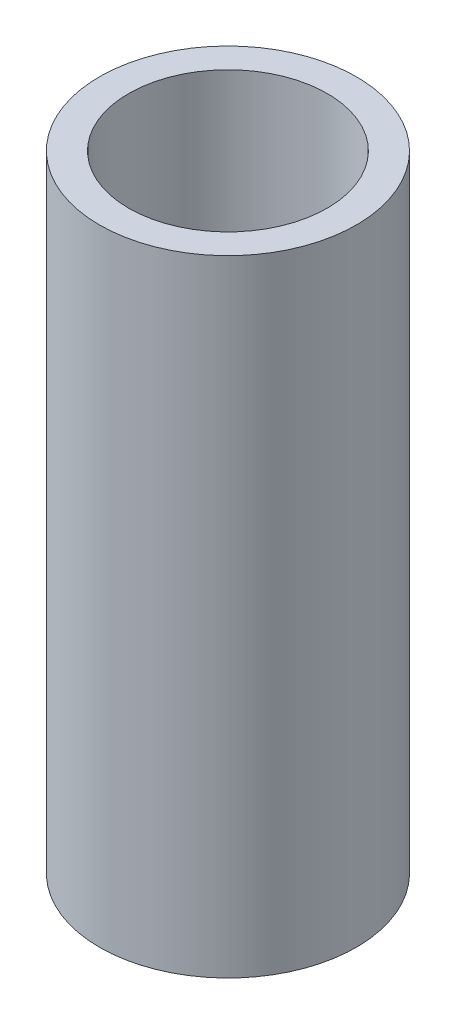
ISO-10303-21;
HEADER;
FILE_DESCRIPTION(('STEP AP214'),'2;1');
FILE_NAME('part.step','',(''),(''),'','','');
FILE_SCHEMA(('AUTOMOTIVE_DESIGN { 1 0 10303 214 1 1 1 1 }'));
ENDSEC;
DATA;
#1=APPLICATION_CONTEXT('core data for automotive mechanical design processes');
#2=APPLICATION_PROTOCOL_DEFINITION('international standard','automotive_design',2000,#1);
#3=PRODUCT_CONTEXT('',#1,'mechanical');
#4=PRODUCT('Part','Part','',(#3));
#5=PRODUCT_RELATED_PRODUCT_CATEGORY('part','',(#4));
#6=PRODUCT_DEFINITION_FORMATION('','',#4);
#7=PRODUCT_DEFINITION_CONTEXT('part definition',#1,'design');
#8=PRODUCT_DEFINITION('design','',#6,#7);
#9=PRODUCT_DEFINITION_SHAPE('','',#8);
#10=(LENGTH_UNIT() NAMED_UNIT(*) SI_UNIT(.MILLI.,.METRE.));
#11=(NAMED_UNIT(*) PLANE_ANGLE_UNIT() SI_UNIT($,.RADIAN.));
#12=(NAMED_UNIT(*) SI_UNIT($,.STERADIAN.) SOLID_ANGLE_UNIT());
#13=UNCERTAINTY_MEASURE_WITH_UNIT(LENGTH_MEASURE(1.E-05),#10,'distance_accuracy_value','');
#14=(GEOMETRIC_REPRESENTATION_CONTEXT(3) GLOBAL_UNCERTAINTY_ASSIGNED_CONTEXT((#13)) GLOBAL_UNIT_ASSIGNED_CONTEXT((#10,
#11,#12)) REPRESENTATION_CONTEXT('',''));
#15=CARTESIAN_POINT('',(0.,0.,0.));
#16=DIRECTION('',(0.,0.,1.));
#17=DIRECTION('',(1.,0.,0.));
#18=AXIS2_PLACEMENT_3D('',#15,#16,#17);
#19=CARTESIAN_POINT('',(0.,-13.8841677594821,0.));
#20=DIRECTION('',(0.,1.,0.));
#21=DIRECTION('',(0.,0.,1.));
#22=AXIS2_PLACEMENT_3D('',#19,#20,#21);
#23=CYLINDRICAL_SURFACE('',#22,5.1308);
#24=CARTESIAN_POINT('',(0.,-13.8841677594821,0.));
#25=DIRECTION('',(0.,1.,0.));
#26=DIRECTION('',(0.,0.,1.));
#27=AXIS2_PLACEMENT_3D('',#24,#25,#26);
#28=CIRCLE('',#27,5.1308);
#29=CARTESIAN_POINT('',(0.,-13.8841677594821,5.1308));
#30=VERTEX_POINT('',#29);
#31=EDGE_CURVE('E12',#30,#30,#28,.T.);
#32=ORIENTED_EDGE('',*,*,#31,.T.);
#33=EDGE_LOOP('',(#32));
#34=FACE_BOUND('',#33,.T.);
#35=CARTESIAN_POINT('',(0.,11.1122322405179,0.));
#36=DIRECTION('',(0.,1.,0.));
#37=DIRECTION('',(0.,0.,1.));
#38=AXIS2_PLACEMENT_3D('',#35,#36,#37);
#39=CIRCLE('',#38,5.1308);
#40=CARTESIAN_POINT('',(0.,11.1122322405179,5.1308));
#41=VERTEX_POINT('',#40);
#42=EDGE_CURVE('E57',#41,#41,#39,.T.);
#43=ORIENTED_EDGE('',*,*,#42,.F.);
#44=EDGE_LOOP('',(#43));
#45=FACE_BOUND('',#44,.T.);
#46=ADVANCED_FACE('F50',(#34,#45),#23,.T.);
#47=CARTESIAN_POINT('',(0.,-13.8841677594821,0.));
#48=DIRECTION('',(0.,1.,0.));
#49=DIRECTION('',(0.,0.,1.));
#50=AXIS2_PLACEMENT_3D('',#47,#48,#49);
#51=PLANE('',#50);
#52=CARTESIAN_POINT('',(0.,-13.8841677594821,0.));
#53=DIRECTION('',(0.,1.,0.));
#54=DIRECTION('',(0.,0.,1.));
#55=AXIS2_PLACEMENT_3D('',#52,#53,#54);
#56=CIRCLE('',#55,3.96875);
#57=CARTESIAN_POINT('',(0.,-13.8841677594821,3.96875));
#58=VERTEX_POINT('',#57);
#59=EDGE_CURVE('E63',#58,#58,#56,.T.);
#60=ORIENTED_EDGE('',*,*,#59,.T.);
#61=EDGE_LOOP('',(#60));
#62=FACE_BOUND('',#61,.T.);
#63=ORIENTED_EDGE('',*,*,#31,.F.);
#64=EDGE_LOOP('',(#63));
#65=FACE_BOUND('',#64,.T.);
#66=ADVANCED_FACE('F79',(#62,#65),#51,.F.);
#67=CARTESIAN_POINT('',(0.,11.1122322405179,0.));
#68=DIRECTION('',(0.,1.,0.));
#69=DIRECTION('',(0.,0.,1.));
#70=AXIS2_PLACEMENT_3D('',#67,#68,#69);
#71=PLANE('',#70);
#72=CARTESIAN_POINT('',(0.,11.1122322405179,0.));
#73=DIRECTION('',(0.,1.,0.));
#74=DIRECTION('',(0.,0.,1.));
#75=AXIS2_PLACEMENT_3D('',#72,#73,#74);
#76=CIRCLE('',#75,3.96875);
#77=CARTESIAN_POINT('',(0.,11.1122322405179,3.96875));
#78=VERTEX_POINT('',#77);
#79=EDGE_CURVE('E68',#78,#78,#76,.T.);
#80=ORIENTED_EDGE('',*,*,#79,.F.);
#81=EDGE_LOOP('',(#80));
#82=FACE_BOUND('',#81,.T.);
#83=ORIENTED_EDGE('',*,*,#42,.T.);
#84=EDGE_LOOP('',(#83));
#85=FACE_BOUND('',#84,.T.);
#86=ADVANCED_FACE('F77',(#82,#85),#71,.T.);
#87=CARTESIAN_POINT('',(0.,-28.8877677594821,0.));
#88=DIRECTION('',(0.,1.,0.));
#89=DIRECTION('',(0.,0.,1.));
#90=AXIS2_PLACEMENT_3D('',#87,#88,#89);
#91=CYLINDRICAL_SURFACE('',#90,3.96875);
#92=ORIENTED_EDGE('',*,*,#79,.T.);
#93=EDGE_LOOP('',(#92));
#94=FACE_BOUND('',#93,.T.);
#95=ORIENTED_EDGE('',*,*,#59,.F.);
#96=EDGE_LOOP('',(#95));
#97=FACE_BOUND('',#96,.T.);
#98=ADVANCED_FACE('F74',(#94,#97),#91,.F.);
#99=CLOSED_SHELL('',(#46,#66,#86,#98));
#100=MANIFOLD_SOLID_BREP('B2',#99);
#101=ADVANCED_BREP_SHAPE_REPRESENTATION('',(#18,#100),#14);
#102=SHAPE_DEFINITION_REPRESENTATION(#9,#101);
ENDSEC;
END-ISO-10303-21;
